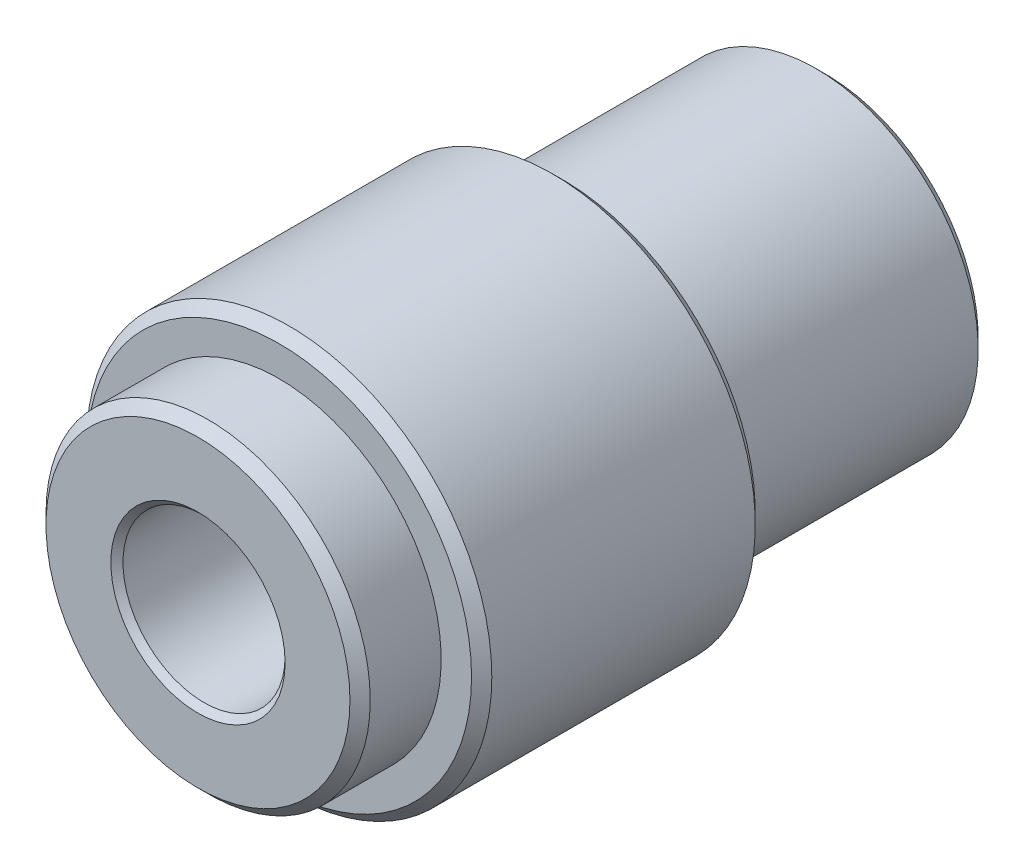
ISO-10303-21;
HEADER;
FILE_DESCRIPTION(('STEP AP214'),'2;1');
FILE_NAME('part.step','',(''),(''),'','','');
FILE_SCHEMA(('AUTOMOTIVE_DESIGN { 1 0 10303 214 1 1 1 1 }'));
ENDSEC;
DATA;
#1=APPLICATION_CONTEXT('core data for automotive mechanical design processes');
#2=APPLICATION_PROTOCOL_DEFINITION('international standard','automotive_design',2000,#1);
#3=PRODUCT_CONTEXT('',#1,'mechanical');
#4=PRODUCT('Part','Part','',(#3));
#5=PRODUCT_RELATED_PRODUCT_CATEGORY('part','',(#4));
#6=PRODUCT_DEFINITION_FORMATION('','',#4);
#7=PRODUCT_DEFINITION_CONTEXT('part definition',#1,'design');
#8=PRODUCT_DEFINITION('design','',#6,#7);
#9=PRODUCT_DEFINITION_SHAPE('','',#8);
#10=(LENGTH_UNIT() NAMED_UNIT(*) SI_UNIT(.MILLI.,.METRE.));
#11=(NAMED_UNIT(*) PLANE_ANGLE_UNIT() SI_UNIT($,.RADIAN.));
#12=(NAMED_UNIT(*) SI_UNIT($,.STERADIAN.) SOLID_ANGLE_UNIT());
#13=UNCERTAINTY_MEASURE_WITH_UNIT(LENGTH_MEASURE(1.E-05),#10,'distance_accuracy_value','');
#14=(GEOMETRIC_REPRESENTATION_CONTEXT(3) GLOBAL_UNCERTAINTY_ASSIGNED_CONTEXT((#13)) GLOBAL_UNIT_ASSIGNED_CONTEXT((#10,
#11,#12)) REPRESENTATION_CONTEXT('',''));
#15=CARTESIAN_POINT('',(0.,0.,0.));
#16=DIRECTION('',(0.,0.,1.));
#17=DIRECTION('',(1.,0.,0.));
#18=AXIS2_PLACEMENT_3D('',#15,#16,#17);
#19=CARTESIAN_POINT('',(0.,0.,0.));
#20=DIRECTION('',(0.,0.,1.));
#21=DIRECTION('',(1.,0.,0.));
#22=AXIS2_PLACEMENT_3D('',#19,#20,#21);
#23=PLANE('',#22);
#24=CARTESIAN_POINT('',(0.,0.,0.));
#25=DIRECTION('',(0.,0.,1.));
#26=DIRECTION('',(1.,0.,0.));
#27=AXIS2_PLACEMENT_3D('',#24,#25,#26);
#28=CIRCLE('',#27,2.15);
#29=CARTESIAN_POINT('',(2.15,0.,0.));
#30=VERTEX_POINT('',#29);
#31=EDGE_CURVE('E51',#30,#30,#28,.F.);
#32=ORIENTED_EDGE('',*,*,#31,.T.);
#33=EDGE_LOOP('',(#32));
#34=FACE_BOUND('',#33,.T.);
#35=CARTESIAN_POINT('',(0.,0.,0.));
#36=DIRECTION('',(0.,0.,1.));
#37=DIRECTION('',(1.,0.,0.));
#38=AXIS2_PLACEMENT_3D('',#35,#36,#37);
#39=CIRCLE('',#38,3.75);
#40=CARTESIAN_POINT('',(3.75,0.,0.));
#41=VERTEX_POINT('',#40);
#42=EDGE_CURVE('E86',#41,#41,#39,.T.);
#43=ORIENTED_EDGE('',*,*,#42,.T.);
#44=EDGE_LOOP('',(#43));
#45=FACE_BOUND('',#44,.T.);
#46=ADVANCED_FACE('F42',(#34,#45),#23,.T.);
#47=CARTESIAN_POINT('',(0.,0.,-15.5));
#48=DIRECTION('',(0.,0.,-1.));
#49=DIRECTION('',(-1.,0.,0.));
#50=AXIS2_PLACEMENT_3D('',#47,#48,#49);
#51=CYLINDRICAL_SURFACE('',#50,4.);
#52=CARTESIAN_POINT('',(0.,0.,-0.249999999999997));
#53=DIRECTION('',(0.,0.,1.));
#54=DIRECTION('',(1.,0.,0.));
#55=AXIS2_PLACEMENT_3D('',#52,#53,#54);
#56=CIRCLE('',#55,4.);
#57=CARTESIAN_POINT('',(4.,0.,-0.249999999999997));
#58=VERTEX_POINT('',#57);
#59=EDGE_CURVE('E90',#58,#58,#56,.F.);
#60=ORIENTED_EDGE('',*,*,#59,.T.);
#61=EDGE_LOOP('',(#60));
#62=FACE_BOUND('',#61,.T.);
#63=CARTESIAN_POINT('',(0.,0.,-2.));
#64=DIRECTION('',(0.,0.,-1.));
#65=DIRECTION('',(-1.,0.,0.));
#66=AXIS2_PLACEMENT_3D('',#63,#64,#65);
#67=CIRCLE('',#66,4.);
#68=CARTESIAN_POINT('',(-4.,0.,-2.));
#69=VERTEX_POINT('',#68);
#70=EDGE_CURVE('E102',#69,#69,#67,.T.);
#71=ORIENTED_EDGE('',*,*,#70,.F.);
#72=EDGE_LOOP('',(#71));
#73=FACE_BOUND('',#72,.T.);
#74=ADVANCED_FACE('F129',(#62,#73),#51,.T.);
#75=CARTESIAN_POINT('',(0.,4.,-2.));
#76=DIRECTION('',(0.,0.,1.));
#77=DIRECTION('',(1.,0.,0.));
#78=AXIS2_PLACEMENT_3D('',#75,#76,#77);
#79=PLANE('',#78);
#80=CARTESIAN_POINT('',(0.,0.,-2.));
#81=DIRECTION('',(0.,0.,1.));
#82=DIRECTION('',(1.,0.,0.));
#83=AXIS2_PLACEMENT_3D('',#80,#81,#82);
#84=CIRCLE('',#83,4.75);
#85=CARTESIAN_POINT('',(4.75,0.,-2.));
#86=VERTEX_POINT('',#85);
#87=EDGE_CURVE('E70',#86,#86,#84,.T.);
#88=ORIENTED_EDGE('',*,*,#87,.T.);
#89=EDGE_LOOP('',(#88));
#90=FACE_BOUND('',#89,.T.);
#91=ORIENTED_EDGE('',*,*,#70,.T.);
#92=EDGE_LOOP('',(#91));
#93=FACE_BOUND('',#92,.T.);
#94=ADVANCED_FACE('F125',(#90,#93),#79,.T.);
#95=CARTESIAN_POINT('',(0.,0.,-15.5));
#96=DIRECTION('',(0.,0.,-1.));
#97=DIRECTION('',(-1.,0.,0.));
#98=AXIS2_PLACEMENT_3D('',#95,#96,#97);
#99=CYLINDRICAL_SURFACE('',#98,5.);
#100=CARTESIAN_POINT('',(0.,0.,-8.75));
#101=DIRECTION('',(0.,0.,-1.));
#102=DIRECTION('',(-1.,0.,0.));
#103=AXIS2_PLACEMENT_3D('',#100,#101,#102);
#104=CIRCLE('',#103,5.);
#105=CARTESIAN_POINT('',(-5.,0.,-8.75));
#106=VERTEX_POINT('',#105);
#107=EDGE_CURVE('E74',#106,#106,#104,.F.);
#108=ORIENTED_EDGE('',*,*,#107,.T.);
#109=EDGE_LOOP('',(#108));
#110=FACE_BOUND('',#109,.T.);
#111=CARTESIAN_POINT('',(0.,0.,-2.25));
#112=DIRECTION('',(0.,0.,1.));
#113=DIRECTION('',(1.,0.,0.));
#114=AXIS2_PLACEMENT_3D('',#111,#112,#113);
#115=CIRCLE('',#114,5.);
#116=CARTESIAN_POINT('',(5.,0.,-2.25));
#117=VERTEX_POINT('',#116);
#118=EDGE_CURVE('E78',#117,#117,#115,.F.);
#119=ORIENTED_EDGE('',*,*,#118,.T.);
#120=EDGE_LOOP('',(#119));
#121=FACE_BOUND('',#120,.T.);
#122=ADVANCED_FACE('F115',(#110,#121),#99,.T.);
#123=CARTESIAN_POINT('',(0.,5.,-9.));
#124=DIRECTION('',(0.,0.,-1.));
#125=DIRECTION('',(-1.,0.,0.));
#126=AXIS2_PLACEMENT_3D('',#123,#124,#125);
#127=PLANE('',#126);
#128=CARTESIAN_POINT('',(0.,0.,-9.));
#129=DIRECTION('',(0.,0.,-1.));
#130=DIRECTION('',(-1.,0.,0.));
#131=AXIS2_PLACEMENT_3D('',#128,#129,#130);
#132=CIRCLE('',#131,4.75);
#133=CARTESIAN_POINT('',(-4.75,0.,-9.));
#134=VERTEX_POINT('',#133);
#135=EDGE_CURVE('E82',#134,#134,#132,.T.);
#136=ORIENTED_EDGE('',*,*,#135,.T.);
#137=EDGE_LOOP('',(#136));
#138=FACE_BOUND('',#137,.T.);
#139=CARTESIAN_POINT('',(0.,0.,-9.));
#140=DIRECTION('',(0.,0.,-1.));
#141=DIRECTION('',(-1.,0.,0.));
#142=AXIS2_PLACEMENT_3D('',#139,#140,#141);
#143=CIRCLE('',#142,4.);
#144=CARTESIAN_POINT('',(-4.,0.,-9.));
#145=VERTEX_POINT('',#144);
#146=EDGE_CURVE('E106',#145,#145,#143,.T.);
#147=ORIENTED_EDGE('',*,*,#146,.F.);
#148=EDGE_LOOP('',(#147));
#149=FACE_BOUND('',#148,.T.);
#150=ADVANCED_FACE('F113',(#138,#149),#127,.T.);
#151=CARTESIAN_POINT('',(0.,0.,-15.5));
#152=DIRECTION('',(0.,0.,-1.));
#153=DIRECTION('',(-1.,0.,0.));
#154=AXIS2_PLACEMENT_3D('',#151,#152,#153);
#155=CYLINDRICAL_SURFACE('',#154,4.);
#156=CARTESIAN_POINT('',(0.,0.,-15.25));
#157=DIRECTION('',(0.,0.,-1.));
#158=DIRECTION('',(-1.,0.,0.));
#159=AXIS2_PLACEMENT_3D('',#156,#157,#158);
#160=CIRCLE('',#159,4.);
#161=CARTESIAN_POINT('',(-4.,0.,-15.25));
#162=VERTEX_POINT('',#161);
#163=EDGE_CURVE('E94',#162,#162,#160,.F.);
#164=ORIENTED_EDGE('',*,*,#163,.T.);
#165=EDGE_LOOP('',(#164));
#166=FACE_BOUND('',#165,.T.);
#167=ORIENTED_EDGE('',*,*,#146,.T.);
#168=EDGE_LOOP('',(#167));
#169=FACE_BOUND('',#168,.T.);
#170=ADVANCED_FACE('F111',(#166,#169),#155,.T.);
#171=CARTESIAN_POINT('',(0.,4.,-15.5));
#172=DIRECTION('',(0.,0.,-1.));
#173=DIRECTION('',(-1.,0.,0.));
#174=AXIS2_PLACEMENT_3D('',#171,#172,#173);
#175=PLANE('',#174);
#176=CARTESIAN_POINT('',(0.,0.,-15.5));
#177=DIRECTION('',(0.,0.,-1.));
#178=DIRECTION('',(-1.,0.,0.));
#179=AXIS2_PLACEMENT_3D('',#176,#177,#178);
#180=CIRCLE('',#179,2.15);
#181=CARTESIAN_POINT('',(-2.15,0.,-15.5));
#182=VERTEX_POINT('',#181);
#183=EDGE_CURVE('E10',#182,#182,#180,.F.);
#184=ORIENTED_EDGE('',*,*,#183,.T.);
#185=EDGE_LOOP('',(#184));
#186=FACE_BOUND('',#185,.T.);
#187=CARTESIAN_POINT('',(0.,0.,-15.5));
#188=DIRECTION('',(0.,0.,-1.));
#189=DIRECTION('',(-1.,0.,0.));
#190=AXIS2_PLACEMENT_3D('',#187,#188,#189);
#191=CIRCLE('',#190,3.75);
#192=CARTESIAN_POINT('',(-3.75,0.,-15.5));
#193=VERTEX_POINT('',#192);
#194=EDGE_CURVE('E98',#193,#193,#191,.T.);
#195=ORIENTED_EDGE('',*,*,#194,.T.);
#196=EDGE_LOOP('',(#195));
#197=FACE_BOUND('',#196,.T.);
#198=ADVANCED_FACE('F122',(#186,#197),#175,.T.);
#199=CARTESIAN_POINT('',(0.,0.,-15.5));
#200=DIRECTION('',(0.,0.,1.));
#201=DIRECTION('',(1.,0.,0.));
#202=AXIS2_PLACEMENT_3D('',#199,#200,#201);
#203=CONICAL_SURFACE('',#202,3.75,0.785398163397448);
#204=ORIENTED_EDGE('',*,*,#163,.F.);
#205=EDGE_LOOP('',(#204));
#206=FACE_BOUND('',#205,.T.);
#207=ORIENTED_EDGE('',*,*,#194,.F.);
#208=EDGE_LOOP('',(#207));
#209=FACE_BOUND('',#208,.T.);
#210=ADVANCED_FACE('F139',(#206,#209),#203,.T.);
#211=CARTESIAN_POINT('',(0.,0.,-0.249999999999997));
#212=DIRECTION('',(0.,0.,-1.));
#213=DIRECTION('',(-1.,0.,0.));
#214=AXIS2_PLACEMENT_3D('',#211,#212,#213);
#215=CONICAL_SURFACE('',#214,4.,0.785398163397455);
#216=ORIENTED_EDGE('',*,*,#42,.F.);
#217=EDGE_LOOP('',(#216));
#218=FACE_BOUND('',#217,.T.);
#219=ORIENTED_EDGE('',*,*,#59,.F.);
#220=EDGE_LOOP('',(#219));
#221=FACE_BOUND('',#220,.T.);
#222=ADVANCED_FACE('F142',(#218,#221),#215,.T.);
#223=CARTESIAN_POINT('',(0.,0.,-9.));
#224=DIRECTION('',(0.,0.,1.));
#225=DIRECTION('',(1.,0.,0.));
#226=AXIS2_PLACEMENT_3D('',#223,#224,#225);
#227=CONICAL_SURFACE('',#226,4.75,0.785398163397447);
#228=ORIENTED_EDGE('',*,*,#107,.F.);
#229=EDGE_LOOP('',(#228));
#230=FACE_BOUND('',#229,.T.);
#231=ORIENTED_EDGE('',*,*,#135,.F.);
#232=EDGE_LOOP('',(#231));
#233=FACE_BOUND('',#232,.T.);
#234=ADVANCED_FACE('F146',(#230,#233),#227,.T.);
#235=CARTESIAN_POINT('',(0.,0.,-2.25));
#236=DIRECTION('',(0.,0.,-1.));
#237=DIRECTION('',(-1.,0.,0.));
#238=AXIS2_PLACEMENT_3D('',#235,#236,#237);
#239=CONICAL_SURFACE('',#238,5.,0.785398163397454);
#240=ORIENTED_EDGE('',*,*,#87,.F.);
#241=EDGE_LOOP('',(#240));
#242=FACE_BOUND('',#241,.T.);
#243=ORIENTED_EDGE('',*,*,#118,.F.);
#244=EDGE_LOOP('',(#243));
#245=FACE_BOUND('',#244,.T.);
#246=ADVANCED_FACE('F150',(#242,#245),#239,.T.);
#247=CARTESIAN_POINT('',(0.,0.,-15.5));
#248=DIRECTION('',(0.,0.,1.));
#249=DIRECTION('',(1.,0.,0.));
#250=AXIS2_PLACEMENT_3D('',#247,#248,#249);
#251=CYLINDRICAL_SURFACE('',#250,2.);
#252=CARTESIAN_POINT('',(0.,0.,-0.149999999999994));
#253=DIRECTION('',(0.,0.,1.));
#254=DIRECTION('',(1.,0.,0.));
#255=AXIS2_PLACEMENT_3D('',#252,#253,#254);
#256=CIRCLE('',#255,2.);
#257=CARTESIAN_POINT('',(2.,0.,-0.149999999999994));
#258=VERTEX_POINT('',#257);
#259=EDGE_CURVE('E58',#258,#258,#256,.T.);
#260=ORIENTED_EDGE('',*,*,#259,.T.);
#261=EDGE_LOOP('',(#260));
#262=FACE_BOUND('',#261,.T.);
#263=CARTESIAN_POINT('',(0.,0.,-15.35));
#264=DIRECTION('',(0.,0.,-1.));
#265=DIRECTION('',(-1.,0.,0.));
#266=AXIS2_PLACEMENT_3D('',#263,#264,#265);
#267=CIRCLE('',#266,2.);
#268=CARTESIAN_POINT('',(-2.,0.,-15.35));
#269=VERTEX_POINT('',#268);
#270=EDGE_CURVE('E64',#269,#269,#267,.T.);
#271=ORIENTED_EDGE('',*,*,#270,.T.);
#272=EDGE_LOOP('',(#271));
#273=FACE_BOUND('',#272,.T.);
#274=ADVANCED_FACE('F153',(#262,#273),#251,.F.);
#275=CARTESIAN_POINT('',(0.,0.,-0.149999999999994));
#276=DIRECTION('',(0.,0.,1.));
#277=DIRECTION('',(1.,0.,0.));
#278=AXIS2_PLACEMENT_3D('',#275,#276,#277);
#279=CONICAL_SURFACE('',#278,2.,0.785398163397454);
#280=ORIENTED_EDGE('',*,*,#31,.F.);
#281=EDGE_LOOP('',(#280));
#282=FACE_BOUND('',#281,.T.);
#283=ORIENTED_EDGE('',*,*,#259,.F.);
#284=EDGE_LOOP('',(#283));
#285=FACE_BOUND('',#284,.T.);
#286=ADVANCED_FACE('F156',(#282,#285),#279,.F.);
#287=CARTESIAN_POINT('',(0.,0.,-15.5));
#288=DIRECTION('',(0.,0.,-1.));
#289=DIRECTION('',(-1.,0.,0.));
#290=AXIS2_PLACEMENT_3D('',#287,#288,#289);
#291=CONICAL_SURFACE('',#290,2.15,0.785398163397454);
#292=ORIENTED_EDGE('',*,*,#270,.F.);
#293=EDGE_LOOP('',(#292));
#294=FACE_BOUND('',#293,.T.);
#295=ORIENTED_EDGE('',*,*,#183,.F.);
#296=EDGE_LOOP('',(#295));
#297=FACE_BOUND('',#296,.T.);
#298=ADVANCED_FACE('F45',(#294,#297),#291,.F.);
#299=CLOSED_SHELL('',(#46,#74,#94,#122,#150,#170,#198,#210,#222,#234,#246,#274,#286,#298));
#300=MANIFOLD_SOLID_BREP('B2',#299);
#301=ADVANCED_BREP_SHAPE_REPRESENTATION('',(#18,#300),#14);
#302=SHAPE_DEFINITION_REPRESENTATION(#9,#301);
ENDSEC;
END-ISO-10303-21;
